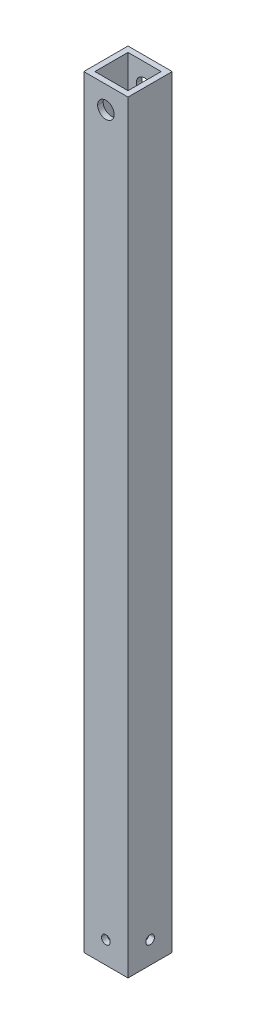
ISO-10303-21;
HEADER;
FILE_DESCRIPTION(('STEP AP214'),'2;1');
FILE_NAME('part.step','',(''),(''),'','','');
FILE_SCHEMA(('AUTOMOTIVE_DESIGN { 1 0 10303 214 1 1 1 1 }'));
ENDSEC;
DATA;
#1=APPLICATION_CONTEXT('core data for automotive mechanical design processes');
#2=APPLICATION_PROTOCOL_DEFINITION('international standard','automotive_design',2000,#1);
#3=PRODUCT_CONTEXT('',#1,'mechanical');
#4=PRODUCT('Part','Part','',(#3));
#5=PRODUCT_RELATED_PRODUCT_CATEGORY('part','',(#4));
#6=PRODUCT_DEFINITION_FORMATION('','',#4);
#7=PRODUCT_DEFINITION_CONTEXT('part definition',#1,'design');
#8=PRODUCT_DEFINITION('design','',#6,#7);
#9=PRODUCT_DEFINITION_SHAPE('','',#8);
#10=(LENGTH_UNIT() NAMED_UNIT(*) SI_UNIT(.MILLI.,.METRE.));
#11=(NAMED_UNIT(*) PLANE_ANGLE_UNIT() SI_UNIT($,.RADIAN.));
#12=(NAMED_UNIT(*) SI_UNIT($,.STERADIAN.) SOLID_ANGLE_UNIT());
#13=UNCERTAINTY_MEASURE_WITH_UNIT(LENGTH_MEASURE(1.E-05),#10,'distance_accuracy_value','');
#14=(GEOMETRIC_REPRESENTATION_CONTEXT(3) GLOBAL_UNCERTAINTY_ASSIGNED_CONTEXT((#13)) GLOBAL_UNIT_ASSIGNED_CONTEXT((#10,
#11,#12)) REPRESENTATION_CONTEXT('',''));
#15=CARTESIAN_POINT('',(0.,0.,0.));
#16=DIRECTION('',(0.,0.,1.));
#17=DIRECTION('',(1.,0.,0.));
#18=AXIS2_PLACEMENT_3D('',#15,#16,#17);
#19=CARTESIAN_POINT('',(-12.7,-206.375,0.));
#20=DIRECTION('',(1.,0.,0.));
#21=DIRECTION('',(0.,0.,-1.));
#22=AXIS2_PLACEMENT_3D('',#19,#20,#21);
#23=CYLINDRICAL_SURFACE('',#22,2.4892);
#24=DIRECTION('',(1.,0.,0.));
#25=VECTOR('',#24,1.);
#26=CARTESIAN_POINT('',(-12.7,-206.375,2.4892));
#27=LINE('',#26,#25);
#28=CARTESIAN_POINT('',(9.525,-206.375,2.4892));
#29=VERTEX_POINT('',#28);
#30=CARTESIAN_POINT('',(12.7,-206.375,2.4892));
#31=VERTEX_POINT('',#30);
#32=EDGE_CURVE('E370',#29,#31,#27,.T.);
#33=ORIENTED_EDGE('',*,*,#32,.F.);
#34=CARTESIAN_POINT('',(9.525,-206.375,0.));
#35=DIRECTION('',(-1.,0.,0.));
#36=DIRECTION('',(0.,0.,1.));
#37=AXIS2_PLACEMENT_3D('',#34,#35,#36);
#38=CIRCLE('',#37,2.4892);
#39=CARTESIAN_POINT('',(9.525,-206.375,-2.4892));
#40=VERTEX_POINT('',#39);
#41=EDGE_CURVE('E287',#29,#40,#38,.T.);
#42=ORIENTED_EDGE('',*,*,#41,.T.);
#43=DIRECTION('',(1.,0.,0.));
#44=VECTOR('',#43,1.);
#45=CARTESIAN_POINT('',(-12.7,-206.375,-2.4892));
#46=LINE('',#45,#44);
#47=CARTESIAN_POINT('',(12.7,-206.375,-2.4892));
#48=VERTEX_POINT('',#47);
#49=EDGE_CURVE('E322',#40,#48,#46,.T.);
#50=ORIENTED_EDGE('',*,*,#49,.T.);
#51=CARTESIAN_POINT('',(12.7,-206.375,0.));
#52=DIRECTION('',(1.,0.,0.));
#53=DIRECTION('',(0.,0.,-1.));
#54=AXIS2_PLACEMENT_3D('',#51,#52,#53);
#55=CIRCLE('',#54,2.4892);
#56=EDGE_CURVE('E367',#48,#31,#55,.T.);
#57=ORIENTED_EDGE('',*,*,#56,.T.);
#58=EDGE_LOOP('',(#33,#42,#50,#57));
#59=FACE_BOUND('',#58,.T.);
#60=ADVANCED_FACE('F17',(#59),#23,.F.);
#61=CARTESIAN_POINT('',(-12.7,-206.375,0.));
#62=DIRECTION('',(1.,0.,0.));
#63=DIRECTION('',(0.,0.,-1.));
#64=AXIS2_PLACEMENT_3D('',#61,#62,#63);
#65=CYLINDRICAL_SURFACE('',#64,2.4892);
#66=DIRECTION('',(1.,0.,0.));
#67=VECTOR('',#66,1.);
#68=CARTESIAN_POINT('',(-12.7,-206.375,2.4892));
#69=LINE('',#68,#67);
#70=CARTESIAN_POINT('',(-12.7,-206.375,2.4892));
#71=VERTEX_POINT('',#70);
#72=CARTESIAN_POINT('',(-9.525,-206.375,2.4892));
#73=VERTEX_POINT('',#72);
#74=EDGE_CURVE('E247',#71,#73,#69,.T.);
#75=ORIENTED_EDGE('',*,*,#74,.F.);
#76=CARTESIAN_POINT('',(-12.7,-206.375,0.));
#77=DIRECTION('',(1.,0.,0.));
#78=DIRECTION('',(0.,0.,-1.));
#79=AXIS2_PLACEMENT_3D('',#76,#77,#78);
#80=CIRCLE('',#79,2.4892);
#81=CARTESIAN_POINT('',(-12.7,-206.375,-2.4892));
#82=VERTEX_POINT('',#81);
#83=EDGE_CURVE('E253',#82,#71,#80,.T.);
#84=ORIENTED_EDGE('',*,*,#83,.F.);
#85=DIRECTION('',(1.,0.,0.));
#86=VECTOR('',#85,1.);
#87=CARTESIAN_POINT('',(-12.7,-206.375,-2.4892));
#88=LINE('',#87,#86);
#89=CARTESIAN_POINT('',(-9.525,-206.375,-2.4892));
#90=VERTEX_POINT('',#89);
#91=EDGE_CURVE('E265',#82,#90,#88,.T.);
#92=ORIENTED_EDGE('',*,*,#91,.T.);
#93=CARTESIAN_POINT('',(-9.525,-206.375,0.));
#94=DIRECTION('',(1.,0.,0.));
#95=DIRECTION('',(0.,0.,-1.));
#96=AXIS2_PLACEMENT_3D('',#93,#94,#95);
#97=CIRCLE('',#96,2.4892);
#98=EDGE_CURVE('E21',#90,#73,#97,.T.);
#99=ORIENTED_EDGE('',*,*,#98,.T.);
#100=EDGE_LOOP('',(#75,#84,#92,#99));
#101=FACE_BOUND('',#100,.T.);
#102=ADVANCED_FACE('F481',(#101),#65,.F.);
#103=CARTESIAN_POINT('',(0.,206.375,-12.7));
#104=DIRECTION('',(0.,0.,1.));
#105=DIRECTION('',(1.,0.,0.));
#106=AXIS2_PLACEMENT_3D('',#103,#104,#105);
#107=CYLINDRICAL_SURFACE('',#106,4.7625);
#108=DIRECTION('',(0.,0.,1.));
#109=VECTOR('',#108,1.);
#110=CARTESIAN_POINT('',(-4.7625,206.375,-12.7));
#111=LINE('',#110,#109);
#112=CARTESIAN_POINT('',(-4.7625,206.375,-12.7));
#113=VERTEX_POINT('',#112);
#114=CARTESIAN_POINT('',(-4.7625,206.375,-9.525));
#115=VERTEX_POINT('',#114);
#116=EDGE_CURVE('E269',#113,#115,#111,.T.);
#117=ORIENTED_EDGE('',*,*,#116,.F.);
#118=CARTESIAN_POINT('',(0.,206.375,-12.7));
#119=DIRECTION('',(0.,0.,1.));
#120=DIRECTION('',(1.,0.,0.));
#121=AXIS2_PLACEMENT_3D('',#118,#119,#120);
#122=CIRCLE('',#121,4.7625);
#123=CARTESIAN_POINT('',(4.7625,206.375,-12.7));
#124=VERTEX_POINT('',#123);
#125=EDGE_CURVE('E294',#124,#113,#122,.T.);
#126=ORIENTED_EDGE('',*,*,#125,.F.);
#127=DIRECTION('',(0.,0.,1.));
#128=VECTOR('',#127,1.);
#129=CARTESIAN_POINT('',(4.7625,206.375,-12.7));
#130=LINE('',#129,#128);
#131=CARTESIAN_POINT('',(4.7625,206.375,-9.525));
#132=VERTEX_POINT('',#131);
#133=EDGE_CURVE('E255',#124,#132,#130,.T.);
#134=ORIENTED_EDGE('',*,*,#133,.T.);
#135=CARTESIAN_POINT('',(0.,206.375,-9.525));
#136=DIRECTION('',(0.,0.,1.));
#137=DIRECTION('',(1.,0.,0.));
#138=AXIS2_PLACEMENT_3D('',#135,#136,#137);
#139=CIRCLE('',#138,4.7625);
#140=EDGE_CURVE('E308',#132,#115,#139,.T.);
#141=ORIENTED_EDGE('',*,*,#140,.T.);
#142=EDGE_LOOP('',(#117,#126,#134,#141));
#143=FACE_BOUND('',#142,.T.);
#144=ADVANCED_FACE('F488',(#143),#107,.F.);
#145=CARTESIAN_POINT('',(0.,-206.375,-12.7));
#146=DIRECTION('',(0.,0.,1.));
#147=DIRECTION('',(1.,0.,0.));
#148=AXIS2_PLACEMENT_3D('',#145,#146,#147);
#149=CYLINDRICAL_SURFACE('',#148,2.4892);
#150=DIRECTION('',(0.,0.,1.));
#151=VECTOR('',#150,1.);
#152=CARTESIAN_POINT('',(-2.4892,-206.375,-12.7));
#153=LINE('',#152,#151);
#154=CARTESIAN_POINT('',(-2.4892,-206.375,-12.7));
#155=VERTEX_POINT('',#154);
#156=CARTESIAN_POINT('',(-2.4892,-206.375,-9.525));
#157=VERTEX_POINT('',#156);
#158=EDGE_CURVE('E335',#155,#157,#153,.T.);
#159=ORIENTED_EDGE('',*,*,#158,.F.);
#160=CARTESIAN_POINT('',(0.,-206.375,-12.7));
#161=DIRECTION('',(0.,0.,1.));
#162=DIRECTION('',(1.,0.,0.));
#163=AXIS2_PLACEMENT_3D('',#160,#161,#162);
#164=CIRCLE('',#163,2.4892);
#165=CARTESIAN_POINT('',(2.4892,-206.375,-12.7));
#166=VERTEX_POINT('',#165);
#167=EDGE_CURVE('E254',#166,#155,#164,.T.);
#168=ORIENTED_EDGE('',*,*,#167,.F.);
#169=DIRECTION('',(0.,0.,1.));
#170=VECTOR('',#169,1.);
#171=CARTESIAN_POINT('',(2.4892,-206.375,-12.7));
#172=LINE('',#171,#170);
#173=CARTESIAN_POINT('',(2.4892,-206.375,-9.525));
#174=VERTEX_POINT('',#173);
#175=EDGE_CURVE('E273',#166,#174,#172,.T.);
#176=ORIENTED_EDGE('',*,*,#175,.T.);
#177=CARTESIAN_POINT('',(0.,-206.375,-9.525));
#178=DIRECTION('',(0.,0.,1.));
#179=DIRECTION('',(1.,0.,0.));
#180=AXIS2_PLACEMENT_3D('',#177,#178,#179);
#181=CIRCLE('',#180,2.4892);
#182=EDGE_CURVE('E311',#174,#157,#181,.T.);
#183=ORIENTED_EDGE('',*,*,#182,.T.);
#184=EDGE_LOOP('',(#159,#168,#176,#183));
#185=FACE_BOUND('',#184,.T.);
#186=ADVANCED_FACE('F477',(#185),#149,.F.);
#187=CARTESIAN_POINT('',(0.,206.375,-12.7));
#188=DIRECTION('',(0.,0.,1.));
#189=DIRECTION('',(1.,0.,0.));
#190=AXIS2_PLACEMENT_3D('',#187,#188,#189);
#191=CYLINDRICAL_SURFACE('',#190,4.7625);
#192=DIRECTION('',(0.,0.,1.));
#193=VECTOR('',#192,1.);
#194=CARTESIAN_POINT('',(-4.7625,206.375,-12.7));
#195=LINE('',#194,#193);
#196=CARTESIAN_POINT('',(-4.7625,206.375,9.525));
#197=VERTEX_POINT('',#196);
#198=CARTESIAN_POINT('',(-4.7625,206.375,12.7));
#199=VERTEX_POINT('',#198);
#200=EDGE_CURVE('E361',#197,#199,#195,.T.);
#201=ORIENTED_EDGE('',*,*,#200,.F.);
#202=CARTESIAN_POINT('',(0.,206.375,9.525));
#203=DIRECTION('',(0.,0.,-1.));
#204=DIRECTION('',(-1.,0.,0.));
#205=AXIS2_PLACEMENT_3D('',#202,#203,#204);
#206=CIRCLE('',#205,4.7625);
#207=CARTESIAN_POINT('',(4.7625,206.375,9.525));
#208=VERTEX_POINT('',#207);
#209=EDGE_CURVE('E28',#197,#208,#206,.T.);
#210=ORIENTED_EDGE('',*,*,#209,.T.);
#211=DIRECTION('',(0.,0.,1.));
#212=VECTOR('',#211,1.);
#213=CARTESIAN_POINT('',(4.7625,206.375,-12.7));
#214=LINE('',#213,#212);
#215=CARTESIAN_POINT('',(4.7625,206.375,12.7));
#216=VERTEX_POINT('',#215);
#217=EDGE_CURVE('E313',#208,#216,#214,.T.);
#218=ORIENTED_EDGE('',*,*,#217,.T.);
#219=CARTESIAN_POINT('',(0.,206.375,12.7));
#220=DIRECTION('',(0.,0.,1.));
#221=DIRECTION('',(1.,0.,0.));
#222=AXIS2_PLACEMENT_3D('',#219,#220,#221);
#223=CIRCLE('',#222,4.7625);
#224=EDGE_CURVE('E324',#216,#199,#223,.T.);
#225=ORIENTED_EDGE('',*,*,#224,.T.);
#226=EDGE_LOOP('',(#201,#210,#218,#225));
#227=FACE_BOUND('',#226,.T.);
#228=ADVANCED_FACE('F403',(#227),#191,.F.);
#229=CARTESIAN_POINT('',(0.,-206.375,-12.7));
#230=DIRECTION('',(0.,0.,1.));
#231=DIRECTION('',(1.,0.,0.));
#232=AXIS2_PLACEMENT_3D('',#229,#230,#231);
#233=CYLINDRICAL_SURFACE('',#232,2.4892);
#234=DIRECTION('',(0.,0.,1.));
#235=VECTOR('',#234,1.);
#236=CARTESIAN_POINT('',(-2.4892,-206.375,-12.7));
#237=LINE('',#236,#235);
#238=CARTESIAN_POINT('',(-2.4892,-206.375,9.525));
#239=VERTEX_POINT('',#238);
#240=CARTESIAN_POINT('',(-2.4892,-206.375,12.7));
#241=VERTEX_POINT('',#240);
#242=EDGE_CURVE('E288',#239,#241,#237,.T.);
#243=ORIENTED_EDGE('',*,*,#242,.F.);
#244=CARTESIAN_POINT('',(0.,-206.375,9.525));
#245=DIRECTION('',(0.,0.,-1.));
#246=DIRECTION('',(-1.,0.,0.));
#247=AXIS2_PLACEMENT_3D('',#244,#245,#246);
#248=CIRCLE('',#247,2.4892);
#249=CARTESIAN_POINT('',(2.4892,-206.375,9.525));
#250=VERTEX_POINT('',#249);
#251=EDGE_CURVE('E11',#239,#250,#248,.T.);
#252=ORIENTED_EDGE('',*,*,#251,.T.);
#253=DIRECTION('',(0.,0.,1.));
#254=VECTOR('',#253,1.);
#255=CARTESIAN_POINT('',(2.4892,-206.375,-12.7));
#256=LINE('',#255,#254);
#257=CARTESIAN_POINT('',(2.4892,-206.375,12.7));
#258=VERTEX_POINT('',#257);
#259=EDGE_CURVE('E304',#250,#258,#256,.T.);
#260=ORIENTED_EDGE('',*,*,#259,.T.);
#261=CARTESIAN_POINT('',(0.,-206.375,12.7));
#262=DIRECTION('',(0.,0.,1.));
#263=DIRECTION('',(1.,0.,0.));
#264=AXIS2_PLACEMENT_3D('',#261,#262,#263);
#265=CIRCLE('',#264,2.4892);
#266=EDGE_CURVE('E219',#258,#241,#265,.T.);
#267=ORIENTED_EDGE('',*,*,#266,.T.);
#268=EDGE_LOOP('',(#243,#252,#260,#267));
#269=FACE_BOUND('',#268,.T.);
#270=ADVANCED_FACE('F465',(#269),#233,.F.);
#271=CARTESIAN_POINT('',(0.,219.075,9.525));
#272=DIRECTION('',(0.,0.,-1.));
#273=DIRECTION('',(0.,-1.,0.));
#274=AXIS2_PLACEMENT_3D('',#271,#272,#273);
#275=PLANE('',#274);
#276=CARTESIAN_POINT('',(0.,-206.375,9.525));
#277=DIRECTION('',(0.,0.,-1.));
#278=DIRECTION('',(-1.,0.,0.));
#279=AXIS2_PLACEMENT_3D('',#276,#277,#278);
#280=CIRCLE('',#279,2.4892);
#281=EDGE_CURVE('E293',#250,#239,#280,.T.);
#282=ORIENTED_EDGE('',*,*,#281,.F.);
#283=ORIENTED_EDGE('',*,*,#251,.F.);
#284=EDGE_LOOP('',(#282,#283));
#285=FACE_BOUND('',#284,.T.);
#286=CARTESIAN_POINT('',(0.,206.375,9.525));
#287=DIRECTION('',(0.,0.,-1.));
#288=DIRECTION('',(-1.,0.,0.));
#289=AXIS2_PLACEMENT_3D('',#286,#287,#288);
#290=CIRCLE('',#289,4.7625);
#291=EDGE_CURVE('E277',#208,#197,#290,.T.);
#292=ORIENTED_EDGE('',*,*,#291,.F.);
#293=ORIENTED_EDGE('',*,*,#209,.F.);
#294=EDGE_LOOP('',(#292,#293));
#295=FACE_BOUND('',#294,.T.);
#296=DIRECTION('',(1.,0.,0.));
#297=VECTOR('',#296,1.);
#298=CARTESIAN_POINT('',(0.,-219.075,9.525));
#299=LINE('',#298,#297);
#300=CARTESIAN_POINT('',(-9.525,-219.075,9.525));
#301=VERTEX_POINT('',#300);
#302=CARTESIAN_POINT('',(9.525,-219.075,9.525));
#303=VERTEX_POINT('',#302);
#304=EDGE_CURVE('E209',#301,#303,#299,.T.);
#305=ORIENTED_EDGE('',*,*,#304,.F.);
#306=DIRECTION('',(0.,-1.,0.));
#307=VECTOR('',#306,1.);
#308=CARTESIAN_POINT('',(-9.525,219.075,9.525));
#309=LINE('',#308,#307);
#310=CARTESIAN_POINT('',(-9.525,219.075,9.525));
#311=VERTEX_POINT('',#310);
#312=EDGE_CURVE('E43',#311,#301,#309,.T.);
#313=ORIENTED_EDGE('',*,*,#312,.F.);
#314=DIRECTION('',(1.,0.,0.));
#315=VECTOR('',#314,1.);
#316=CARTESIAN_POINT('',(0.,219.075,9.525));
#317=LINE('',#316,#315);
#318=CARTESIAN_POINT('',(9.525,219.075,9.525));
#319=VERTEX_POINT('',#318);
#320=EDGE_CURVE('E212',#311,#319,#317,.T.);
#321=ORIENTED_EDGE('',*,*,#320,.T.);
#322=DIRECTION('',(0.,-1.,0.));
#323=VECTOR('',#322,1.);
#324=CARTESIAN_POINT('',(9.525,219.075,9.525));
#325=LINE('',#324,#323);
#326=EDGE_CURVE('E206',#319,#303,#325,.T.);
#327=ORIENTED_EDGE('',*,*,#326,.T.);
#328=EDGE_LOOP('',(#305,#313,#321,#327));
#329=FACE_BOUND('',#328,.T.);
#330=ADVANCED_FACE('F208',(#285,#295,#329),#275,.T.);
#331=CARTESIAN_POINT('',(-9.525,219.075,0.));
#332=DIRECTION('',(1.,0.,0.));
#333=DIRECTION('',(0.,1.,0.));
#334=AXIS2_PLACEMENT_3D('',#331,#332,#333);
#335=PLANE('',#334);
#336=ORIENTED_EDGE('',*,*,#98,.F.);
#337=CARTESIAN_POINT('',(-9.525,-206.375,0.));
#338=DIRECTION('',(1.,0.,0.));
#339=DIRECTION('',(0.,0.,-1.));
#340=AXIS2_PLACEMENT_3D('',#337,#338,#339);
#341=CIRCLE('',#340,2.4892);
#342=EDGE_CURVE('E261',#73,#90,#341,.T.);
#343=ORIENTED_EDGE('',*,*,#342,.F.);
#344=EDGE_LOOP('',(#336,#343));
#345=FACE_BOUND('',#344,.T.);
#346=DIRECTION('',(0.,0.,1.));
#347=VECTOR('',#346,1.);
#348=CARTESIAN_POINT('',(-9.525,-219.075,0.));
#349=LINE('',#348,#347);
#350=CARTESIAN_POINT('',(-9.525,-219.075,-9.525));
#351=VERTEX_POINT('',#350);
#352=EDGE_CURVE('E227',#351,#301,#349,.T.);
#353=ORIENTED_EDGE('',*,*,#352,.F.);
#354=DIRECTION('',(0.,-1.,0.));
#355=VECTOR('',#354,1.);
#356=CARTESIAN_POINT('',(-9.525,219.075,-9.525));
#357=LINE('',#356,#355);
#358=CARTESIAN_POINT('',(-9.525,219.075,-9.525));
#359=VERTEX_POINT('',#358);
#360=EDGE_CURVE('E312',#359,#351,#357,.T.);
#361=ORIENTED_EDGE('',*,*,#360,.F.);
#362=DIRECTION('',(0.,0.,1.));
#363=VECTOR('',#362,1.);
#364=CARTESIAN_POINT('',(-9.525,219.075,0.));
#365=LINE('',#364,#363);
#366=EDGE_CURVE('E331',#359,#311,#365,.T.);
#367=ORIENTED_EDGE('',*,*,#366,.T.);
#368=ORIENTED_EDGE('',*,*,#312,.T.);
#369=EDGE_LOOP('',(#353,#361,#367,#368));
#370=FACE_BOUND('',#369,.T.);
#371=ADVANCED_FACE('F475',(#345,#370),#335,.T.);
#372=CARTESIAN_POINT('',(0.,219.075,-9.525));
#373=DIRECTION('',(0.,0.,1.));
#374=DIRECTION('',(1.,0.,0.));
#375=AXIS2_PLACEMENT_3D('',#372,#373,#374);
#376=PLANE('',#375);
#377=ORIENTED_EDGE('',*,*,#182,.F.);
#378=CARTESIAN_POINT('',(0.,-206.375,-9.525));
#379=DIRECTION('',(0.,0.,1.));
#380=DIRECTION('',(1.,0.,0.));
#381=AXIS2_PLACEMENT_3D('',#378,#379,#380);
#382=CIRCLE('',#381,2.4892);
#383=EDGE_CURVE('E278',#157,#174,#382,.T.);
#384=ORIENTED_EDGE('',*,*,#383,.F.);
#385=EDGE_LOOP('',(#377,#384));
#386=FACE_BOUND('',#385,.T.);
#387=ORIENTED_EDGE('',*,*,#140,.F.);
#388=CARTESIAN_POINT('',(0.,206.375,-9.525));
#389=DIRECTION('',(0.,0.,1.));
#390=DIRECTION('',(1.,0.,0.));
#391=AXIS2_PLACEMENT_3D('',#388,#389,#390);
#392=CIRCLE('',#391,4.7625);
#393=EDGE_CURVE('E260',#115,#132,#392,.T.);
#394=ORIENTED_EDGE('',*,*,#393,.F.);
#395=EDGE_LOOP('',(#387,#394));
#396=FACE_BOUND('',#395,.T.);
#397=DIRECTION('',(-1.,0.,0.));
#398=VECTOR('',#397,1.);
#399=CARTESIAN_POINT('',(0.,-219.075,-9.525));
#400=LINE('',#399,#398);
#401=CARTESIAN_POINT('',(9.525,-219.075,-9.525));
#402=VERTEX_POINT('',#401);
#403=EDGE_CURVE('E234',#402,#351,#400,.T.);
#404=ORIENTED_EDGE('',*,*,#403,.F.);
#405=DIRECTION('',(0.,-1.,0.));
#406=VECTOR('',#405,1.);
#407=CARTESIAN_POINT('',(9.525,219.075,-9.525));
#408=LINE('',#407,#406);
#409=CARTESIAN_POINT('',(9.525,219.075,-9.525));
#410=VERTEX_POINT('',#409);
#411=EDGE_CURVE('E218',#410,#402,#408,.T.);
#412=ORIENTED_EDGE('',*,*,#411,.F.);
#413=DIRECTION('',(-1.,0.,0.));
#414=VECTOR('',#413,1.);
#415=CARTESIAN_POINT('',(0.,219.075,-9.525));
#416=LINE('',#415,#414);
#417=EDGE_CURVE('E279',#410,#359,#416,.T.);
#418=ORIENTED_EDGE('',*,*,#417,.T.);
#419=ORIENTED_EDGE('',*,*,#360,.T.);
#420=EDGE_LOOP('',(#404,#412,#418,#419));
#421=FACE_BOUND('',#420,.T.);
#422=ADVANCED_FACE('F495',(#386,#396,#421),#376,.T.);
#423=CARTESIAN_POINT('',(9.525,219.075,0.));
#424=DIRECTION('',(-1.,0.,0.));
#425=DIRECTION('',(0.,0.,1.));
#426=AXIS2_PLACEMENT_3D('',#423,#424,#425);
#427=PLANE('',#426);
#428=CARTESIAN_POINT('',(9.525,-206.375,0.));
#429=DIRECTION('',(-1.,0.,0.));
#430=DIRECTION('',(0.,0.,1.));
#431=AXIS2_PLACEMENT_3D('',#428,#429,#430);
#432=CIRCLE('',#431,2.4892);
#433=EDGE_CURVE('E374',#40,#29,#432,.T.);
#434=ORIENTED_EDGE('',*,*,#433,.F.);
#435=ORIENTED_EDGE('',*,*,#41,.F.);
#436=EDGE_LOOP('',(#434,#435));
#437=FACE_BOUND('',#436,.T.);
#438=DIRECTION('',(0.,0.,-1.));
#439=VECTOR('',#438,1.);
#440=CARTESIAN_POINT('',(9.525,-219.075,0.));
#441=LINE('',#440,#439);
#442=EDGE_CURVE('E226',#303,#402,#441,.T.);
#443=ORIENTED_EDGE('',*,*,#442,.F.);
#444=ORIENTED_EDGE('',*,*,#326,.F.);
#445=DIRECTION('',(0.,0.,-1.));
#446=VECTOR('',#445,1.);
#447=CARTESIAN_POINT('',(9.525,219.075,0.));
#448=LINE('',#447,#446);
#449=EDGE_CURVE('E282',#319,#410,#448,.T.);
#450=ORIENTED_EDGE('',*,*,#449,.T.);
#451=ORIENTED_EDGE('',*,*,#411,.T.);
#452=EDGE_LOOP('',(#443,#444,#450,#451));
#453=FACE_BOUND('',#452,.T.);
#454=ADVANCED_FACE('F231',(#437,#453),#427,.T.);
#455=CARTESIAN_POINT('',(-12.7,219.075,12.7));
#456=DIRECTION('',(0.,0.,-1.));
#457=DIRECTION('',(0.,-1.,0.));
#458=AXIS2_PLACEMENT_3D('',#455,#456,#457);
#459=PLANE('',#458);
#460=ORIENTED_EDGE('',*,*,#266,.F.);
#461=CARTESIAN_POINT('',(0.,-206.375,12.7));
#462=DIRECTION('',(0.,0.,1.));
#463=DIRECTION('',(1.,0.,0.));
#464=AXIS2_PLACEMENT_3D('',#461,#462,#463);
#465=CIRCLE('',#464,2.4892);
#466=EDGE_CURVE('E292',#241,#258,#465,.T.);
#467=ORIENTED_EDGE('',*,*,#466,.F.);
#468=EDGE_LOOP('',(#460,#467));
#469=FACE_BOUND('',#468,.T.);
#470=ORIENTED_EDGE('',*,*,#224,.F.);
#471=CARTESIAN_POINT('',(0.,206.375,12.7));
#472=DIRECTION('',(0.,0.,1.));
#473=DIRECTION('',(1.,0.,0.));
#474=AXIS2_PLACEMENT_3D('',#471,#472,#473);
#475=CIRCLE('',#474,4.7625);
#476=EDGE_CURVE('E316',#199,#216,#475,.T.);
#477=ORIENTED_EDGE('',*,*,#476,.F.);
#478=EDGE_LOOP('',(#470,#477));
#479=FACE_BOUND('',#478,.T.);
#480=DIRECTION('',(1.,0.,0.));
#481=VECTOR('',#480,1.);
#482=CARTESIAN_POINT('',(-12.7,-219.075,12.7));
#483=LINE('',#482,#481);
#484=CARTESIAN_POINT('',(-12.7,-219.075,12.7));
#485=VERTEX_POINT('',#484);
#486=CARTESIAN_POINT('',(12.7,-219.075,12.7));
#487=VERTEX_POINT('',#486);
#488=EDGE_CURVE('E351',#485,#487,#483,.T.);
#489=ORIENTED_EDGE('',*,*,#488,.T.);
#490=DIRECTION('',(0.,-1.,0.));
#491=VECTOR('',#490,1.);
#492=CARTESIAN_POINT('',(12.7,219.075,12.7));
#493=LINE('',#492,#491);
#494=CARTESIAN_POINT('',(12.7,219.075,12.7));
#495=VERTEX_POINT('',#494);
#496=EDGE_CURVE('E354',#495,#487,#493,.T.);
#497=ORIENTED_EDGE('',*,*,#496,.F.);
#498=DIRECTION('',(1.,0.,0.));
#499=VECTOR('',#498,1.);
#500=CARTESIAN_POINT('',(-12.7,219.075,12.7));
#501=LINE('',#500,#499);
#502=CARTESIAN_POINT('',(-12.7,219.075,12.7));
#503=VERTEX_POINT('',#502);
#504=EDGE_CURVE('E283',#503,#495,#501,.T.);
#505=ORIENTED_EDGE('',*,*,#504,.F.);
#506=DIRECTION('',(0.,-1.,0.));
#507=VECTOR('',#506,1.);
#508=CARTESIAN_POINT('',(-12.7,219.075,12.7));
#509=LINE('',#508,#507);
#510=EDGE_CURVE('E250',#503,#485,#509,.T.);
#511=ORIENTED_EDGE('',*,*,#510,.T.);
#512=EDGE_LOOP('',(#489,#497,#505,#511));
#513=FACE_BOUND('',#512,.T.);
#514=ADVANCED_FACE('F408',(#469,#479,#513),#459,.F.);
#515=CARTESIAN_POINT('',(-12.7,219.075,12.7));
#516=DIRECTION('',(1.,0.,0.));
#517=DIRECTION('',(0.,1.,0.));
#518=AXIS2_PLACEMENT_3D('',#515,#516,#517);
#519=PLANE('',#518);
#520=ORIENTED_EDGE('',*,*,#83,.T.);
#521=CARTESIAN_POINT('',(-12.7,-206.375,0.));
#522=DIRECTION('',(1.,0.,0.));
#523=DIRECTION('',(0.,0.,-1.));
#524=AXIS2_PLACEMENT_3D('',#521,#522,#523);
#525=CIRCLE('',#524,2.4892);
#526=EDGE_CURVE('E318',#71,#82,#525,.T.);
#527=ORIENTED_EDGE('',*,*,#526,.T.);
#528=EDGE_LOOP('',(#520,#527));
#529=FACE_BOUND('',#528,.T.);
#530=DIRECTION('',(0.,0.,1.));
#531=VECTOR('',#530,1.);
#532=CARTESIAN_POINT('',(-12.7,-219.075,12.7));
#533=LINE('',#532,#531);
#534=CARTESIAN_POINT('',(-12.7,-219.075,-12.7));
#535=VERTEX_POINT('',#534);
#536=EDGE_CURVE('E244',#535,#485,#533,.T.);
#537=ORIENTED_EDGE('',*,*,#536,.T.);
#538=ORIENTED_EDGE('',*,*,#510,.F.);
#539=DIRECTION('',(0.,0.,1.));
#540=VECTOR('',#539,1.);
#541=CARTESIAN_POINT('',(-12.7,219.075,12.7));
#542=LINE('',#541,#540);
#543=CARTESIAN_POINT('',(-12.7,219.075,-12.7));
#544=VERTEX_POINT('',#543);
#545=EDGE_CURVE('E302',#544,#503,#542,.T.);
#546=ORIENTED_EDGE('',*,*,#545,.F.);
#547=DIRECTION('',(0.,-1.,0.));
#548=VECTOR('',#547,1.);
#549=CARTESIAN_POINT('',(-12.7,219.075,-12.7));
#550=LINE('',#549,#548);
#551=EDGE_CURVE('E297',#544,#535,#550,.T.);
#552=ORIENTED_EDGE('',*,*,#551,.T.);
#553=EDGE_LOOP('',(#537,#538,#546,#552));
#554=FACE_BOUND('',#553,.T.);
#555=ADVANCED_FACE('F411',(#529,#554),#519,.F.);
#556=CARTESIAN_POINT('',(-12.7,219.075,-12.7));
#557=DIRECTION('',(0.,0.,1.));
#558=DIRECTION('',(1.,0.,0.));
#559=AXIS2_PLACEMENT_3D('',#556,#557,#558);
#560=PLANE('',#559);
#561=ORIENTED_EDGE('',*,*,#167,.T.);
#562=CARTESIAN_POINT('',(0.,-206.375,-12.7));
#563=DIRECTION('',(0.,0.,1.));
#564=DIRECTION('',(1.,0.,0.));
#565=AXIS2_PLACEMENT_3D('',#562,#563,#564);
#566=CIRCLE('',#565,2.4892);
#567=EDGE_CURVE('E259',#155,#166,#566,.T.);
#568=ORIENTED_EDGE('',*,*,#567,.T.);
#569=EDGE_LOOP('',(#561,#568));
#570=FACE_BOUND('',#569,.T.);
#571=ORIENTED_EDGE('',*,*,#125,.T.);
#572=CARTESIAN_POINT('',(0.,206.375,-12.7));
#573=DIRECTION('',(0.,0.,1.));
#574=DIRECTION('',(1.,0.,0.));
#575=AXIS2_PLACEMENT_3D('',#572,#573,#574);
#576=CIRCLE('',#575,4.7625);
#577=EDGE_CURVE('E272',#113,#124,#576,.T.);
#578=ORIENTED_EDGE('',*,*,#577,.T.);
#579=EDGE_LOOP('',(#571,#578));
#580=FACE_BOUND('',#579,.T.);
#581=DIRECTION('',(-1.,0.,0.));
#582=VECTOR('',#581,1.);
#583=CARTESIAN_POINT('',(-12.7,-219.075,-12.7));
#584=LINE('',#583,#582);
#585=CARTESIAN_POINT('',(12.7,-219.075,-12.7));
#586=VERTEX_POINT('',#585);
#587=EDGE_CURVE('E235',#586,#535,#584,.T.);
#588=ORIENTED_EDGE('',*,*,#587,.T.);
#589=ORIENTED_EDGE('',*,*,#551,.F.);
#590=DIRECTION('',(-1.,0.,0.));
#591=VECTOR('',#590,1.);
#592=CARTESIAN_POINT('',(-12.7,219.075,-12.7));
#593=LINE('',#592,#591);
#594=CARTESIAN_POINT('',(12.7,219.075,-12.7));
#595=VERTEX_POINT('',#594);
#596=EDGE_CURVE('E298',#595,#544,#593,.T.);
#597=ORIENTED_EDGE('',*,*,#596,.F.);
#598=DIRECTION('',(0.,-1.,0.));
#599=VECTOR('',#598,1.);
#600=CARTESIAN_POINT('',(12.7,219.075,-12.7));
#601=LINE('',#600,#599);
#602=EDGE_CURVE('E229',#595,#586,#601,.T.);
#603=ORIENTED_EDGE('',*,*,#602,.T.);
#604=EDGE_LOOP('',(#588,#589,#597,#603));
#605=FACE_BOUND('',#604,.T.);
#606=ADVANCED_FACE('F528',(#570,#580,#605),#560,.F.);
#607=CARTESIAN_POINT('',(12.7,219.075,12.7));
#608=DIRECTION('',(-1.,0.,0.));
#609=DIRECTION('',(0.,0.,1.));
#610=AXIS2_PLACEMENT_3D('',#607,#608,#609);
#611=PLANE('',#610);
#612=ORIENTED_EDGE('',*,*,#56,.F.);
#613=CARTESIAN_POINT('',(12.7,-206.375,0.));
#614=DIRECTION('',(1.,0.,0.));
#615=DIRECTION('',(0.,0.,-1.));
#616=AXIS2_PLACEMENT_3D('',#613,#614,#615);
#617=CIRCLE('',#616,2.4892);
#618=EDGE_CURVE('E344',#31,#48,#617,.T.);
#619=ORIENTED_EDGE('',*,*,#618,.F.);
#620=EDGE_LOOP('',(#612,#619));
#621=FACE_BOUND('',#620,.T.);
#622=DIRECTION('',(0.,0.,-1.));
#623=VECTOR('',#622,1.);
#624=CARTESIAN_POINT('',(12.7,-219.075,12.7));
#625=LINE('',#624,#623);
#626=EDGE_CURVE('E347',#487,#586,#625,.T.);
#627=ORIENTED_EDGE('',*,*,#626,.T.);
#628=ORIENTED_EDGE('',*,*,#602,.F.);
#629=DIRECTION('',(0.,0.,-1.));
#630=VECTOR('',#629,1.);
#631=CARTESIAN_POINT('',(12.7,219.075,12.7));
#632=LINE('',#631,#630);
#633=EDGE_CURVE('E303',#495,#595,#632,.T.);
#634=ORIENTED_EDGE('',*,*,#633,.F.);
#635=ORIENTED_EDGE('',*,*,#496,.T.);
#636=EDGE_LOOP('',(#627,#628,#634,#635));
#637=FACE_BOUND('',#636,.T.);
#638=ADVANCED_FACE('F424',(#621,#637),#611,.F.);
#639=CARTESIAN_POINT('',(0.,-219.075,0.));
#640=DIRECTION('',(0.,1.,0.));
#641=DIRECTION('',(1.,0.,0.));
#642=AXIS2_PLACEMENT_3D('',#639,#640,#641);
#643=PLANE('',#642);
#644=ORIENTED_EDGE('',*,*,#442,.T.);
#645=ORIENTED_EDGE('',*,*,#403,.T.);
#646=ORIENTED_EDGE('',*,*,#352,.T.);
#647=ORIENTED_EDGE('',*,*,#304,.T.);
#648=EDGE_LOOP('',(#644,#645,#646,#647));
#649=FACE_BOUND('',#648,.T.);
#650=ORIENTED_EDGE('',*,*,#626,.F.);
#651=ORIENTED_EDGE('',*,*,#488,.F.);
#652=ORIENTED_EDGE('',*,*,#536,.F.);
#653=ORIENTED_EDGE('',*,*,#587,.F.);
#654=EDGE_LOOP('',(#650,#651,#652,#653));
#655=FACE_BOUND('',#654,.T.);
#656=ADVANCED_FACE('F223',(#649,#655),#643,.F.);
#657=CARTESIAN_POINT('',(0.,219.075,0.));
#658=DIRECTION('',(0.,1.,0.));
#659=DIRECTION('',(1.,0.,0.));
#660=AXIS2_PLACEMENT_3D('',#657,#658,#659);
#661=PLANE('',#660);
#662=ORIENTED_EDGE('',*,*,#417,.F.);
#663=ORIENTED_EDGE('',*,*,#449,.F.);
#664=ORIENTED_EDGE('',*,*,#320,.F.);
#665=ORIENTED_EDGE('',*,*,#366,.F.);
#666=EDGE_LOOP('',(#662,#663,#664,#665));
#667=FACE_BOUND('',#666,.T.);
#668=ORIENTED_EDGE('',*,*,#633,.T.);
#669=ORIENTED_EDGE('',*,*,#596,.T.);
#670=ORIENTED_EDGE('',*,*,#545,.T.);
#671=ORIENTED_EDGE('',*,*,#504,.T.);
#672=EDGE_LOOP('',(#668,#669,#670,#671));
#673=FACE_BOUND('',#672,.T.);
#674=ADVANCED_FACE('F428',(#667,#673),#661,.T.);
#675=CARTESIAN_POINT('',(0.,-206.375,-12.7));
#676=DIRECTION('',(0.,0.,1.));
#677=DIRECTION('',(1.,0.,0.));
#678=AXIS2_PLACEMENT_3D('',#675,#676,#677);
#679=CYLINDRICAL_SURFACE('',#678,2.4892);
#680=ORIENTED_EDGE('',*,*,#281,.T.);
#681=ORIENTED_EDGE('',*,*,#242,.T.);
#682=ORIENTED_EDGE('',*,*,#466,.T.);
#683=ORIENTED_EDGE('',*,*,#259,.F.);
#684=EDGE_LOOP('',(#680,#681,#682,#683));
#685=FACE_BOUND('',#684,.T.);
#686=ADVANCED_FACE('F461',(#685),#679,.F.);
#687=CARTESIAN_POINT('',(0.,206.375,-12.7));
#688=DIRECTION('',(0.,0.,1.));
#689=DIRECTION('',(1.,0.,0.));
#690=AXIS2_PLACEMENT_3D('',#687,#688,#689);
#691=CYLINDRICAL_SURFACE('',#690,4.7625);
#692=ORIENTED_EDGE('',*,*,#291,.T.);
#693=ORIENTED_EDGE('',*,*,#200,.T.);
#694=ORIENTED_EDGE('',*,*,#476,.T.);
#695=ORIENTED_EDGE('',*,*,#217,.F.);
#696=EDGE_LOOP('',(#692,#693,#694,#695));
#697=FACE_BOUND('',#696,.T.);
#698=ADVANCED_FACE('F19',(#697),#691,.F.);
#699=CARTESIAN_POINT('',(0.,-206.375,-12.7));
#700=DIRECTION('',(0.,0.,1.));
#701=DIRECTION('',(1.,0.,0.));
#702=AXIS2_PLACEMENT_3D('',#699,#700,#701);
#703=CYLINDRICAL_SURFACE('',#702,2.4892);
#704=ORIENTED_EDGE('',*,*,#567,.F.);
#705=ORIENTED_EDGE('',*,*,#158,.T.);
#706=ORIENTED_EDGE('',*,*,#383,.T.);
#707=ORIENTED_EDGE('',*,*,#175,.F.);
#708=EDGE_LOOP('',(#704,#705,#706,#707));
#709=FACE_BOUND('',#708,.T.);
#710=ADVANCED_FACE('F523',(#709),#703,.F.);
#711=CARTESIAN_POINT('',(0.,206.375,-12.7));
#712=DIRECTION('',(0.,0.,1.));
#713=DIRECTION('',(1.,0.,0.));
#714=AXIS2_PLACEMENT_3D('',#711,#712,#713);
#715=CYLINDRICAL_SURFACE('',#714,4.7625);
#716=ORIENTED_EDGE('',*,*,#577,.F.);
#717=ORIENTED_EDGE('',*,*,#116,.T.);
#718=ORIENTED_EDGE('',*,*,#393,.T.);
#719=ORIENTED_EDGE('',*,*,#133,.F.);
#720=EDGE_LOOP('',(#716,#717,#718,#719));
#721=FACE_BOUND('',#720,.T.);
#722=ADVANCED_FACE('F520',(#721),#715,.F.);
#723=CARTESIAN_POINT('',(-12.7,-206.375,0.));
#724=DIRECTION('',(1.,0.,0.));
#725=DIRECTION('',(0.,0.,-1.));
#726=AXIS2_PLACEMENT_3D('',#723,#724,#725);
#727=CYLINDRICAL_SURFACE('',#726,2.4892);
#728=ORIENTED_EDGE('',*,*,#526,.F.);
#729=ORIENTED_EDGE('',*,*,#74,.T.);
#730=ORIENTED_EDGE('',*,*,#342,.T.);
#731=ORIENTED_EDGE('',*,*,#91,.F.);
#732=EDGE_LOOP('',(#728,#729,#730,#731));
#733=FACE_BOUND('',#732,.T.);
#734=ADVANCED_FACE('F522',(#733),#727,.F.);
#735=CARTESIAN_POINT('',(-12.7,-206.375,0.));
#736=DIRECTION('',(1.,0.,0.));
#737=DIRECTION('',(0.,0.,-1.));
#738=AXIS2_PLACEMENT_3D('',#735,#736,#737);
#739=CYLINDRICAL_SURFACE('',#738,2.4892);
#740=ORIENTED_EDGE('',*,*,#433,.T.);
#741=ORIENTED_EDGE('',*,*,#32,.T.);
#742=ORIENTED_EDGE('',*,*,#618,.T.);
#743=ORIENTED_EDGE('',*,*,#49,.F.);
#744=EDGE_LOOP('',(#740,#741,#742,#743));
#745=FACE_BOUND('',#744,.T.);
#746=ADVANCED_FACE('F559',(#745),#739,.F.);
#747=CLOSED_SHELL('',(#60,#102,#144,#186,#228,#270,#330,#371,#422,#454,#514,#555,#606,#638,#656,
#674,#686,#698,#710,#722,#734,#746));
#748=MANIFOLD_SOLID_BREP('B1',#747);
#749=ADVANCED_BREP_SHAPE_REPRESENTATION('',(#18,#748),#14);
#750=SHAPE_DEFINITION_REPRESENTATION(#9,#749);
ENDSEC;
END-ISO-10303-21;
